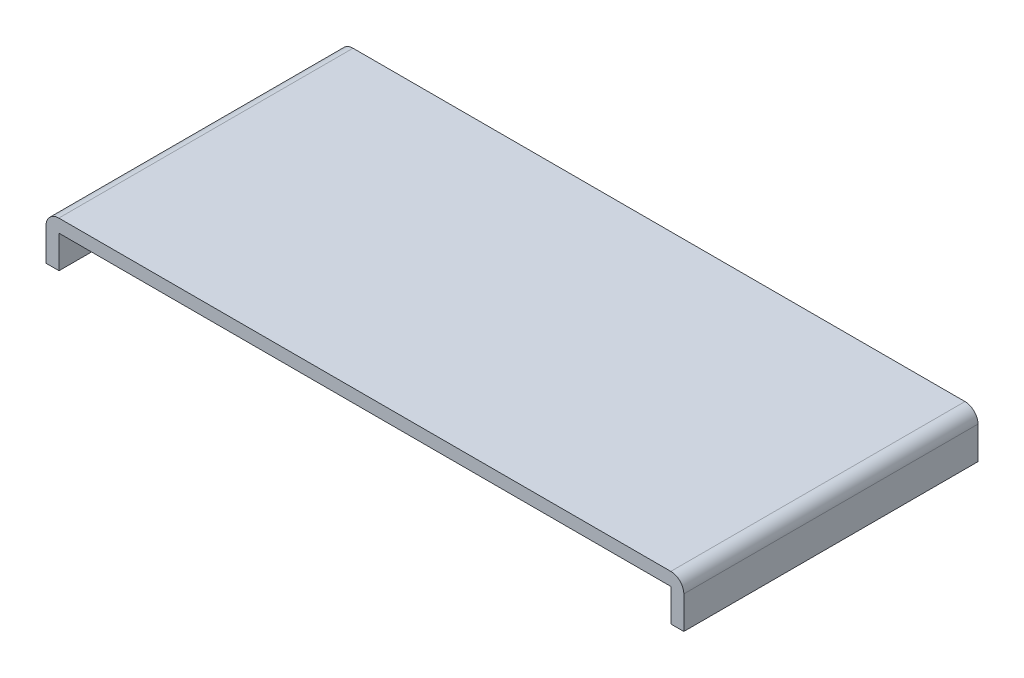
ISO-10303-21;
HEADER;
FILE_DESCRIPTION(('STEP AP214'),'2;1');
FILE_NAME('part.step','',(''),(''),'','','');
FILE_SCHEMA(('AUTOMOTIVE_DESIGN { 1 0 10303 214 1 1 1 1 }'));
ENDSEC;
DATA;
#1=APPLICATION_CONTEXT('core data for automotive mechanical design processes');
#2=APPLICATION_PROTOCOL_DEFINITION('international standard','automotive_design',2000,#1);
#3=PRODUCT_CONTEXT('',#1,'mechanical');
#4=PRODUCT('Part','Part','',(#3));
#5=PRODUCT_RELATED_PRODUCT_CATEGORY('part','',(#4));
#6=PRODUCT_DEFINITION_FORMATION('','',#4);
#7=PRODUCT_DEFINITION_CONTEXT('part definition',#1,'design');
#8=PRODUCT_DEFINITION('design','',#6,#7);
#9=PRODUCT_DEFINITION_SHAPE('','',#8);
#10=(LENGTH_UNIT() NAMED_UNIT(*) SI_UNIT(.MILLI.,.METRE.));
#11=(NAMED_UNIT(*) PLANE_ANGLE_UNIT() SI_UNIT($,.RADIAN.));
#12=(NAMED_UNIT(*) SI_UNIT($,.STERADIAN.) SOLID_ANGLE_UNIT());
#13=UNCERTAINTY_MEASURE_WITH_UNIT(LENGTH_MEASURE(1.E-05),#10,'distance_accuracy_value','');
#14=(GEOMETRIC_REPRESENTATION_CONTEXT(3) GLOBAL_UNCERTAINTY_ASSIGNED_CONTEXT((#13)) GLOBAL_UNIT_ASSIGNED_CONTEXT((#10,
#11,#12)) REPRESENTATION_CONTEXT('',''));
#15=CARTESIAN_POINT('',(0.,0.,0.));
#16=DIRECTION('',(0.,0.,1.));
#17=DIRECTION('',(1.,0.,0.));
#18=AXIS2_PLACEMENT_3D('',#15,#16,#17);
#19=CARTESIAN_POINT('',(0.,0.,0.));
#20=DIRECTION('',(0.,-1.,0.));
#21=DIRECTION('',(0.,0.,-1.));
#22=AXIS2_PLACEMENT_3D('',#19,#20,#21);
#23=PLANE('',#22);
#24=DIRECTION('',(-1.,0.,0.));
#25=VECTOR('',#24,1.);
#26=CARTESIAN_POINT('',(0.,0.,-57.404));
#27=LINE('',#26,#25);
#28=CARTESIAN_POINT('',(121.92,0.,-57.404));
#29=VERTEX_POINT('',#28);
#30=CARTESIAN_POINT('',(2.54,0.,-57.404));
#31=VERTEX_POINT('',#30);
#32=EDGE_CURVE('E51',#29,#31,#27,.T.);
#33=ORIENTED_EDGE('',*,*,#32,.F.);
#34=DIRECTION('',(0.,0.,-1.));
#35=VECTOR('',#34,1.);
#36=CARTESIAN_POINT('',(121.92,0.,0.));
#37=LINE('',#36,#35);
#38=CARTESIAN_POINT('',(121.92,0.,0.));
#39=VERTEX_POINT('',#38);
#40=EDGE_CURVE('E133',#39,#29,#37,.T.);
#41=ORIENTED_EDGE('',*,*,#40,.F.);
#42=DIRECTION('',(1.,0.,0.));
#43=VECTOR('',#42,1.);
#44=CARTESIAN_POINT('',(0.,0.,0.));
#45=LINE('',#44,#43);
#46=CARTESIAN_POINT('',(2.53999999999999,0.,0.));
#47=VERTEX_POINT('',#46);
#48=EDGE_CURVE('E178',#47,#39,#45,.T.);
#49=ORIENTED_EDGE('',*,*,#48,.F.);
#50=DIRECTION('',(0.,0.,1.));
#51=VECTOR('',#50,1.);
#52=CARTESIAN_POINT('',(2.53999999999999,0.,0.));
#53=LINE('',#52,#51);
#54=EDGE_CURVE('E138',#31,#47,#53,.T.);
#55=ORIENTED_EDGE('',*,*,#54,.F.);
#56=EDGE_LOOP('',(#33,#41,#49,#55));
#57=FACE_BOUND('',#56,.T.);
#58=ADVANCED_FACE('F36',(#57),#23,.T.);
#59=CARTESIAN_POINT('',(0.,2.54,0.));
#60=DIRECTION('',(0.,0.,-1.));
#61=DIRECTION('',(-1.,0.,0.));
#62=AXIS2_PLACEMENT_3D('',#59,#60,#61);
#63=PLANE('',#62);
#64=CARTESIAN_POINT('',(121.92,0.,0.));
#65=DIRECTION('',(0.,0.,-1.));
#66=DIRECTION('',(-1.,0.,0.));
#67=AXIS2_PLACEMENT_3D('',#64,#65,#66);
#68=CIRCLE('',#67,2.54000000000001);
#69=CARTESIAN_POINT('',(121.92,2.54,0.));
#70=VERTEX_POINT('',#69);
#71=CARTESIAN_POINT('',(124.46,0.,0.));
#72=VERTEX_POINT('',#71);
#73=EDGE_CURVE('E59',#70,#72,#68,.T.);
#74=ORIENTED_EDGE('',*,*,#73,.F.);
#75=DIRECTION('',(1.,0.,0.));
#76=VECTOR('',#75,1.);
#77=CARTESIAN_POINT('',(0.,2.54,0.));
#78=LINE('',#77,#76);
#79=CARTESIAN_POINT('',(2.50430484271643,2.54,0.));
#80=VERTEX_POINT('',#79);
#81=EDGE_CURVE('E179',#80,#70,#78,.T.);
#82=ORIENTED_EDGE('',*,*,#81,.F.);
#83=CARTESIAN_POINT('',(2.52215242135825,0.0178475786417527,0.));
#84=DIRECTION('',(0.,0.,-1.));
#85=DIRECTION('',(-1.,0.,0.));
#86=AXIS2_PLACEMENT_3D('',#83,#84,#85);
#87=CIRCLE('',#86,2.52221556823096);
#88=CARTESIAN_POINT('',(0.,0.0356951572835025,0.));
#89=VERTEX_POINT('',#88);
#90=EDGE_CURVE('E175',#89,#80,#87,.T.);
#91=ORIENTED_EDGE('',*,*,#90,.F.);
#92=DIRECTION('',(0.,-1.,0.));
#93=VECTOR('',#92,1.);
#94=CARTESIAN_POINT('',(0.,2.54,0.));
#95=LINE('',#94,#93);
#96=CARTESIAN_POINT('',(0.,-6.35,0.));
#97=VERTEX_POINT('',#96);
#98=EDGE_CURVE('E44',#89,#97,#95,.T.);
#99=ORIENTED_EDGE('',*,*,#98,.T.);
#100=DIRECTION('',(-1.,0.,0.));
#101=VECTOR('',#100,1.);
#102=CARTESIAN_POINT('',(0.,-6.35,0.));
#103=LINE('',#102,#101);
#104=CARTESIAN_POINT('',(2.53999999999999,-6.35,0.));
#105=VERTEX_POINT('',#104);
#106=EDGE_CURVE('E153',#105,#97,#103,.T.);
#107=ORIENTED_EDGE('',*,*,#106,.F.);
#108=DIRECTION('',(0.,1.,0.));
#109=VECTOR('',#108,1.);
#110=CARTESIAN_POINT('',(2.53999999999999,-6.35,0.));
#111=LINE('',#110,#109);
#112=EDGE_CURVE('E155',#105,#47,#111,.T.);
#113=ORIENTED_EDGE('',*,*,#112,.T.);
#114=ORIENTED_EDGE('',*,*,#48,.T.);
#115=DIRECTION('',(0.,1.,0.));
#116=VECTOR('',#115,1.);
#117=CARTESIAN_POINT('',(121.92,-6.35,0.));
#118=LINE('',#117,#116);
#119=CARTESIAN_POINT('',(121.92,-6.35,0.));
#120=VERTEX_POINT('',#119);
#121=EDGE_CURVE('E121',#120,#39,#118,.T.);
#122=ORIENTED_EDGE('',*,*,#121,.F.);
#123=DIRECTION('',(-1.,0.,0.));
#124=VECTOR('',#123,1.);
#125=CARTESIAN_POINT('',(124.46,-6.35,0.));
#126=LINE('',#125,#124);
#127=CARTESIAN_POINT('',(124.46,-6.35,0.));
#128=VERTEX_POINT('',#127);
#129=EDGE_CURVE('E114',#128,#120,#126,.T.);
#130=ORIENTED_EDGE('',*,*,#129,.F.);
#131=DIRECTION('',(0.,1.,0.));
#132=VECTOR('',#131,1.);
#133=CARTESIAN_POINT('',(124.46,-6.35,0.));
#134=LINE('',#133,#132);
#135=EDGE_CURVE('E118',#128,#72,#134,.T.);
#136=ORIENTED_EDGE('',*,*,#135,.T.);
#137=EDGE_LOOP('',(#74,#82,#91,#99,#107,#113,#114,#122,#130,#136));
#138=FACE_BOUND('',#137,.T.);
#139=ADVANCED_FACE('F116',(#138),#63,.F.);
#140=CARTESIAN_POINT('',(0.,2.54,-57.404));
#141=DIRECTION('',(0.,0.,1.));
#142=DIRECTION('',(1.,0.,0.));
#143=AXIS2_PLACEMENT_3D('',#140,#141,#142);
#144=PLANE('',#143);
#145=CARTESIAN_POINT('',(121.92,0.,-57.404));
#146=DIRECTION('',(0.,0.,1.));
#147=DIRECTION('',(1.,0.,0.));
#148=AXIS2_PLACEMENT_3D('',#145,#146,#147);
#149=CIRCLE('',#148,2.54000000000001);
#150=CARTESIAN_POINT('',(124.46,0.,-57.404));
#151=VERTEX_POINT('',#150);
#152=CARTESIAN_POINT('',(121.92,2.54,-57.404));
#153=VERTEX_POINT('',#152);
#154=EDGE_CURVE('E165',#151,#153,#149,.T.);
#155=ORIENTED_EDGE('',*,*,#154,.F.);
#156=DIRECTION('',(0.,1.,0.));
#157=VECTOR('',#156,1.);
#158=CARTESIAN_POINT('',(124.46,-6.35,-57.404));
#159=LINE('',#158,#157);
#160=CARTESIAN_POINT('',(124.46,-6.35,-57.404));
#161=VERTEX_POINT('',#160);
#162=EDGE_CURVE('E210',#161,#151,#159,.T.);
#163=ORIENTED_EDGE('',*,*,#162,.F.);
#164=DIRECTION('',(1.,0.,0.));
#165=VECTOR('',#164,1.);
#166=CARTESIAN_POINT('',(124.46,-6.35,-57.404));
#167=LINE('',#166,#165);
#168=CARTESIAN_POINT('',(121.92,-6.35,-57.404));
#169=VERTEX_POINT('',#168);
#170=EDGE_CURVE('E130',#169,#161,#167,.T.);
#171=ORIENTED_EDGE('',*,*,#170,.F.);
#172=DIRECTION('',(0.,1.,0.));
#173=VECTOR('',#172,1.);
#174=CARTESIAN_POINT('',(121.92,-6.35,-57.404));
#175=LINE('',#174,#173);
#176=EDGE_CURVE('E143',#169,#29,#175,.T.);
#177=ORIENTED_EDGE('',*,*,#176,.T.);
#178=ORIENTED_EDGE('',*,*,#32,.T.);
#179=DIRECTION('',(0.,1.,0.));
#180=VECTOR('',#179,1.);
#181=CARTESIAN_POINT('',(2.54,-6.35,-57.404));
#182=LINE('',#181,#180);
#183=CARTESIAN_POINT('',(2.54,-6.35,-57.404));
#184=VERTEX_POINT('',#183);
#185=EDGE_CURVE('E159',#184,#31,#182,.T.);
#186=ORIENTED_EDGE('',*,*,#185,.F.);
#187=DIRECTION('',(1.,0.,0.));
#188=VECTOR('',#187,1.);
#189=CARTESIAN_POINT('',(0.,-6.35,-57.404));
#190=LINE('',#189,#188);
#191=CARTESIAN_POINT('',(0.,-6.35,-57.404));
#192=VERTEX_POINT('',#191);
#193=EDGE_CURVE('E149',#192,#184,#190,.T.);
#194=ORIENTED_EDGE('',*,*,#193,.F.);
#195=DIRECTION('',(0.,-1.,0.));
#196=VECTOR('',#195,1.);
#197=CARTESIAN_POINT('',(0.,2.54,-57.404));
#198=LINE('',#197,#196);
#199=CARTESIAN_POINT('',(0.,0.0356951572835025,-57.404));
#200=VERTEX_POINT('',#199);
#201=EDGE_CURVE('E183',#200,#192,#198,.T.);
#202=ORIENTED_EDGE('',*,*,#201,.F.);
#203=CARTESIAN_POINT('',(2.52215242135825,0.0178475786417527,-57.404));
#204=DIRECTION('',(0.,0.,1.));
#205=DIRECTION('',(1.,0.,0.));
#206=AXIS2_PLACEMENT_3D('',#203,#204,#205);
#207=CIRCLE('',#206,2.52221556823096);
#208=CARTESIAN_POINT('',(2.50430484271643,2.54,-57.404));
#209=VERTEX_POINT('',#208);
#210=EDGE_CURVE('E11',#209,#200,#207,.T.);
#211=ORIENTED_EDGE('',*,*,#210,.F.);
#212=DIRECTION('',(-1.,0.,0.));
#213=VECTOR('',#212,1.);
#214=CARTESIAN_POINT('',(0.,2.54,-57.404));
#215=LINE('',#214,#213);
#216=EDGE_CURVE('E181',#153,#209,#215,.T.);
#217=ORIENTED_EDGE('',*,*,#216,.F.);
#218=EDGE_LOOP('',(#155,#163,#171,#177,#178,#186,#194,#202,#211,#217));
#219=FACE_BOUND('',#218,.T.);
#220=ADVANCED_FACE('F199',(#219),#144,.F.);
#221=CARTESIAN_POINT('',(0.,2.54,0.));
#222=DIRECTION('',(0.,-1.,0.));
#223=DIRECTION('',(0.,0.,-1.));
#224=AXIS2_PLACEMENT_3D('',#221,#222,#223);
#225=PLANE('',#224);
#226=ORIENTED_EDGE('',*,*,#81,.T.);
#227=DIRECTION('',(0.,0.,-1.));
#228=VECTOR('',#227,1.);
#229=CARTESIAN_POINT('',(121.92,2.54,171.354723526957));
#230=LINE('',#229,#228);
#231=EDGE_CURVE('E162',#70,#153,#230,.T.);
#232=ORIENTED_EDGE('',*,*,#231,.T.);
#233=ORIENTED_EDGE('',*,*,#216,.T.);
#234=DIRECTION('',(0.,0.,-1.));
#235=VECTOR('',#234,1.);
#236=CARTESIAN_POINT('',(2.50430484271646,2.54,171.354723526957));
#237=LINE('',#236,#235);
#238=EDGE_CURVE('E169',#80,#209,#237,.T.);
#239=ORIENTED_EDGE('',*,*,#238,.F.);
#240=EDGE_LOOP('',(#226,#232,#233,#239));
#241=FACE_BOUND('',#240,.T.);
#242=ADVANCED_FACE('F227',(#241),#225,.F.);
#243=CARTESIAN_POINT('',(0.,2.54,0.));
#244=DIRECTION('',(1.,0.,0.));
#245=DIRECTION('',(0.,0.,-1.));
#246=AXIS2_PLACEMENT_3D('',#243,#244,#245);
#247=PLANE('',#246);
#248=DIRECTION('',(0.,0.,-1.));
#249=VECTOR('',#248,1.);
#250=CARTESIAN_POINT('',(0.,0.0356951572835025,171.354723526957));
#251=LINE('',#250,#249);
#252=EDGE_CURVE('E172',#200,#89,#251,.F.);
#253=ORIENTED_EDGE('',*,*,#252,.F.);
#254=ORIENTED_EDGE('',*,*,#201,.T.);
#255=DIRECTION('',(0.,0.,-1.));
#256=VECTOR('',#255,1.);
#257=CARTESIAN_POINT('',(0.,-6.35,0.));
#258=LINE('',#257,#256);
#259=EDGE_CURVE('E141',#97,#192,#258,.T.);
#260=ORIENTED_EDGE('',*,*,#259,.F.);
#261=ORIENTED_EDGE('',*,*,#98,.F.);
#262=EDGE_LOOP('',(#253,#254,#260,#261));
#263=FACE_BOUND('',#262,.T.);
#264=ADVANCED_FACE('F38',(#263),#247,.F.);
#265=CARTESIAN_POINT('',(2.52215242135825,0.0178475786417527,171.354723526957));
#266=DIRECTION('',(0.,0.,-1.));
#267=DIRECTION('',(-1.,0.,0.));
#268=AXIS2_PLACEMENT_3D('',#265,#266,#267);
#269=CYLINDRICAL_SURFACE('',#268,2.52221556823096);
#270=ORIENTED_EDGE('',*,*,#252,.T.);
#271=ORIENTED_EDGE('',*,*,#90,.T.);
#272=ORIENTED_EDGE('',*,*,#238,.T.);
#273=ORIENTED_EDGE('',*,*,#210,.T.);
#274=EDGE_LOOP('',(#270,#271,#272,#273));
#275=FACE_BOUND('',#274,.T.);
#276=ADVANCED_FACE('F237',(#275),#269,.T.);
#277=CARTESIAN_POINT('',(121.92,0.,171.354723526957));
#278=DIRECTION('',(0.,0.,-1.));
#279=DIRECTION('',(-1.,0.,0.));
#280=AXIS2_PLACEMENT_3D('',#277,#278,#279);
#281=CYLINDRICAL_SURFACE('',#280,2.54000000000001);
#282=ORIENTED_EDGE('',*,*,#231,.F.);
#283=ORIENTED_EDGE('',*,*,#73,.T.);
#284=DIRECTION('',(0.,0.,-1.));
#285=VECTOR('',#284,1.);
#286=CARTESIAN_POINT('',(124.46,0.,0.));
#287=LINE('',#286,#285);
#288=EDGE_CURVE('E137',#72,#151,#287,.T.);
#289=ORIENTED_EDGE('',*,*,#288,.T.);
#290=ORIENTED_EDGE('',*,*,#154,.T.);
#291=EDGE_LOOP('',(#282,#283,#289,#290));
#292=FACE_BOUND('',#291,.T.);
#293=ADVANCED_FACE('F240',(#292),#281,.T.);
#294=CARTESIAN_POINT('',(2.53999999999999,-6.35,0.));
#295=DIRECTION('',(-1.,0.,0.));
#296=DIRECTION('',(0.,0.,1.));
#297=AXIS2_PLACEMENT_3D('',#294,#295,#296);
#298=PLANE('',#297);
#299=ORIENTED_EDGE('',*,*,#54,.T.);
#300=ORIENTED_EDGE('',*,*,#112,.F.);
#301=DIRECTION('',(0.,0.,1.));
#302=VECTOR('',#301,1.);
#303=CARTESIAN_POINT('',(2.53999999999999,-6.35,0.));
#304=LINE('',#303,#302);
#305=EDGE_CURVE('E151',#184,#105,#304,.T.);
#306=ORIENTED_EDGE('',*,*,#305,.F.);
#307=ORIENTED_EDGE('',*,*,#185,.T.);
#308=EDGE_LOOP('',(#299,#300,#306,#307));
#309=FACE_BOUND('',#308,.T.);
#310=ADVANCED_FACE('F201',(#309),#298,.F.);
#311=CARTESIAN_POINT('',(0.,-6.35,0.));
#312=DIRECTION('',(0.,-1.,0.));
#313=DIRECTION('',(0.,0.,-1.));
#314=AXIS2_PLACEMENT_3D('',#311,#312,#313);
#315=PLANE('',#314);
#316=ORIENTED_EDGE('',*,*,#259,.T.);
#317=ORIENTED_EDGE('',*,*,#193,.T.);
#318=ORIENTED_EDGE('',*,*,#305,.T.);
#319=ORIENTED_EDGE('',*,*,#106,.T.);
#320=EDGE_LOOP('',(#316,#317,#318,#319));
#321=FACE_BOUND('',#320,.T.);
#322=ADVANCED_FACE('F193',(#321),#315,.T.);
#323=CARTESIAN_POINT('',(124.46,-6.35,0.));
#324=DIRECTION('',(-1.,0.,0.));
#325=DIRECTION('',(0.,0.,1.));
#326=AXIS2_PLACEMENT_3D('',#323,#324,#325);
#327=PLANE('',#326);
#328=ORIENTED_EDGE('',*,*,#288,.F.);
#329=ORIENTED_EDGE('',*,*,#135,.F.);
#330=DIRECTION('',(0.,0.,1.));
#331=VECTOR('',#330,1.);
#332=CARTESIAN_POINT('',(124.46,-6.35,0.));
#333=LINE('',#332,#331);
#334=EDGE_CURVE('E125',#161,#128,#333,.T.);
#335=ORIENTED_EDGE('',*,*,#334,.F.);
#336=ORIENTED_EDGE('',*,*,#162,.T.);
#337=EDGE_LOOP('',(#328,#329,#335,#336));
#338=FACE_BOUND('',#337,.T.);
#339=ADVANCED_FACE('F135',(#338),#327,.F.);
#340=CARTESIAN_POINT('',(121.92,-6.35,0.));
#341=DIRECTION('',(1.,0.,0.));
#342=DIRECTION('',(0.,0.,-1.));
#343=AXIS2_PLACEMENT_3D('',#340,#341,#342);
#344=PLANE('',#343);
#345=ORIENTED_EDGE('',*,*,#40,.T.);
#346=ORIENTED_EDGE('',*,*,#176,.F.);
#347=DIRECTION('',(0.,0.,-1.));
#348=VECTOR('',#347,1.);
#349=CARTESIAN_POINT('',(121.92,-6.35,0.));
#350=LINE('',#349,#348);
#351=EDGE_CURVE('E124',#120,#169,#350,.T.);
#352=ORIENTED_EDGE('',*,*,#351,.F.);
#353=ORIENTED_EDGE('',*,*,#121,.T.);
#354=EDGE_LOOP('',(#345,#346,#352,#353));
#355=FACE_BOUND('',#354,.T.);
#356=ADVANCED_FACE('F211',(#355),#344,.F.);
#357=CARTESIAN_POINT('',(0.,-6.35,0.));
#358=DIRECTION('',(0.,1.,0.));
#359=DIRECTION('',(0.,0.,1.));
#360=AXIS2_PLACEMENT_3D('',#357,#358,#359);
#361=PLANE('',#360);
#362=ORIENTED_EDGE('',*,*,#334,.T.);
#363=ORIENTED_EDGE('',*,*,#129,.T.);
#364=ORIENTED_EDGE('',*,*,#351,.T.);
#365=ORIENTED_EDGE('',*,*,#170,.T.);
#366=EDGE_LOOP('',(#362,#363,#364,#365));
#367=FACE_BOUND('',#366,.T.);
#368=ADVANCED_FACE('F128',(#367),#361,.F.);
#369=CLOSED_SHELL('',(#58,#139,#220,#242,#264,#276,#293,#310,#322,#339,#356,#368));
#370=MANIFOLD_SOLID_BREP('B2',#369);
#371=ADVANCED_BREP_SHAPE_REPRESENTATION('',(#18,#370),#14);
#372=SHAPE_DEFINITION_REPRESENTATION(#9,#371);
ENDSEC;
END-ISO-10303-21;
